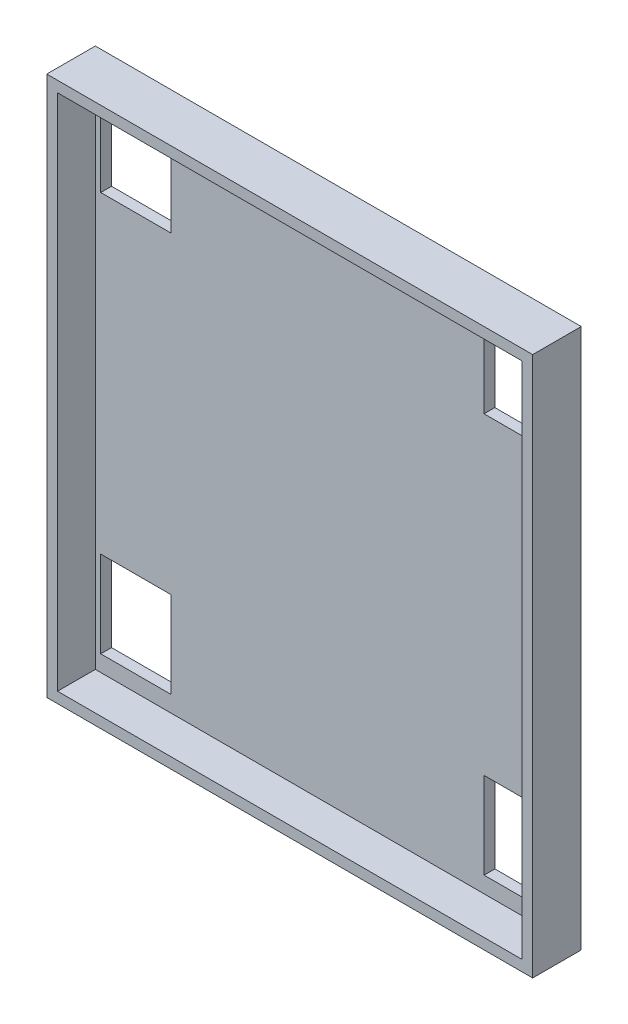
ISO-10303-21;
HEADER;
FILE_DESCRIPTION(('STEP AP214'),'2;1');
FILE_NAME('part.step','',(''),(''),'','','');
FILE_SCHEMA(('AUTOMOTIVE_DESIGN { 1 0 10303 214 1 1 1 1 }'));
ENDSEC;
DATA;
#1=APPLICATION_CONTEXT('core data for automotive mechanical design processes');
#2=APPLICATION_PROTOCOL_DEFINITION('international standard','automotive_design',2000,#1);
#3=PRODUCT_CONTEXT('',#1,'mechanical');
#4=PRODUCT('Part','Part','',(#3));
#5=PRODUCT_RELATED_PRODUCT_CATEGORY('part','',(#4));
#6=PRODUCT_DEFINITION_FORMATION('','',#4);
#7=PRODUCT_DEFINITION_CONTEXT('part definition',#1,'design');
#8=PRODUCT_DEFINITION('design','',#6,#7);
#9=PRODUCT_DEFINITION_SHAPE('','',#8);
#10=(LENGTH_UNIT() NAMED_UNIT(*) SI_UNIT(.MILLI.,.METRE.));
#11=(NAMED_UNIT(*) PLANE_ANGLE_UNIT() SI_UNIT($,.RADIAN.));
#12=(NAMED_UNIT(*) SI_UNIT($,.STERADIAN.) SOLID_ANGLE_UNIT());
#13=UNCERTAINTY_MEASURE_WITH_UNIT(LENGTH_MEASURE(1.E-05),#10,'distance_accuracy_value','');
#14=(GEOMETRIC_REPRESENTATION_CONTEXT(3) GLOBAL_UNCERTAINTY_ASSIGNED_CONTEXT((#13)) GLOBAL_UNIT_ASSIGNED_CONTEXT((#10,
#11,#12)) REPRESENTATION_CONTEXT('',''));
#15=CARTESIAN_POINT('',(0.,0.,0.));
#16=DIRECTION('',(0.,0.,1.));
#17=DIRECTION('',(1.,0.,0.));
#18=AXIS2_PLACEMENT_3D('',#15,#16,#17);
#19=CARTESIAN_POINT('',(0.,0.,2.));
#20=DIRECTION('',(0.,0.,1.));
#21=DIRECTION('',(1.,0.,0.));
#22=AXIS2_PLACEMENT_3D('',#19,#20,#21);
#23=PLANE('',#22);
#24=DIRECTION('',(0.,-1.,0.));
#25=VECTOR('',#24,1.);
#26=CARTESIAN_POINT('',(-43.,-48.,2.));
#27=LINE('',#26,#25);
#28=CARTESIAN_POINT('',(-43.,48.,2.));
#29=VERTEX_POINT('',#28);
#30=CARTESIAN_POINT('',(-43.,-48.,2.));
#31=VERTEX_POINT('',#30);
#32=EDGE_CURVE('E47',#29,#31,#27,.T.);
#33=ORIENTED_EDGE('',*,*,#32,.T.);
#34=DIRECTION('',(1.,0.,0.));
#35=VECTOR('',#34,1.);
#36=CARTESIAN_POINT('',(-43.,-48.,2.));
#37=LINE('',#36,#35);
#38=CARTESIAN_POINT('',(43.,-48.,2.));
#39=VERTEX_POINT('',#38);
#40=EDGE_CURVE('E51',#31,#39,#37,.T.);
#41=ORIENTED_EDGE('',*,*,#40,.T.);
#42=DIRECTION('',(0.,1.,0.));
#43=VECTOR('',#42,1.);
#44=CARTESIAN_POINT('',(43.,-48.,2.));
#45=LINE('',#44,#43);
#46=CARTESIAN_POINT('',(43.,48.,2.));
#47=VERTEX_POINT('',#46);
#48=EDGE_CURVE('E221',#39,#47,#45,.T.);
#49=ORIENTED_EDGE('',*,*,#48,.T.);
#50=DIRECTION('',(-1.,0.,0.));
#51=VECTOR('',#50,1.);
#52=CARTESIAN_POINT('',(-43.,48.,2.));
#53=LINE('',#52,#51);
#54=EDGE_CURVE('E202',#47,#29,#53,.T.);
#55=ORIENTED_EDGE('',*,*,#54,.T.);
#56=EDGE_LOOP('',(#33,#41,#49,#55));
#57=FACE_BOUND('',#56,.T.);
#58=DIRECTION('',(-1.,0.,0.));
#59=VECTOR('',#58,1.);
#60=CARTESIAN_POINT('',(29.,45.,2.));
#61=LINE('',#60,#59);
#62=CARTESIAN_POINT('',(42.,45.,2.));
#63=VERTEX_POINT('',#62);
#64=CARTESIAN_POINT('',(29.,45.,2.));
#65=VERTEX_POINT('',#64);
#66=EDGE_CURVE('E336',#63,#65,#61,.T.);
#67=ORIENTED_EDGE('',*,*,#66,.F.);
#68=DIRECTION('',(0.,1.,0.));
#69=VECTOR('',#68,1.);
#70=CARTESIAN_POINT('',(42.,45.,2.));
#71=LINE('',#70,#69);
#72=CARTESIAN_POINT('',(42.,29.,2.));
#73=VERTEX_POINT('',#72);
#74=EDGE_CURVE('E334',#73,#63,#71,.T.);
#75=ORIENTED_EDGE('',*,*,#74,.F.);
#76=DIRECTION('',(1.,0.,0.));
#77=VECTOR('',#76,1.);
#78=CARTESIAN_POINT('',(29.,29.,2.));
#79=LINE('',#78,#77);
#80=CARTESIAN_POINT('',(29.,29.,2.));
#81=VERTEX_POINT('',#80);
#82=EDGE_CURVE('E342',#81,#73,#79,.T.);
#83=ORIENTED_EDGE('',*,*,#82,.F.);
#84=DIRECTION('',(0.,-1.,0.));
#85=VECTOR('',#84,1.);
#86=CARTESIAN_POINT('',(29.,45.,2.));
#87=LINE('',#86,#85);
#88=EDGE_CURVE('E339',#65,#81,#87,.T.);
#89=ORIENTED_EDGE('',*,*,#88,.F.);
#90=EDGE_LOOP('',(#67,#75,#83,#89));
#91=FACE_BOUND('',#90,.T.);
#92=DIRECTION('',(1.,0.,0.));
#93=VECTOR('',#92,1.);
#94=CARTESIAN_POINT('',(29.,-45.,2.));
#95=LINE('',#94,#93);
#96=CARTESIAN_POINT('',(29.,-45.,2.));
#97=VERTEX_POINT('',#96);
#98=CARTESIAN_POINT('',(42.,-45.,2.));
#99=VERTEX_POINT('',#98);
#100=EDGE_CURVE('E305',#97,#99,#95,.T.);
#101=ORIENTED_EDGE('',*,*,#100,.F.);
#102=DIRECTION('',(0.,-1.,0.));
#103=VECTOR('',#102,1.);
#104=CARTESIAN_POINT('',(29.,-45.,2.));
#105=LINE('',#104,#103);
#106=CARTESIAN_POINT('',(29.,-29.,2.));
#107=VERTEX_POINT('',#106);
#108=EDGE_CURVE('E303',#107,#97,#105,.T.);
#109=ORIENTED_EDGE('',*,*,#108,.F.);
#110=DIRECTION('',(-1.,0.,0.));
#111=VECTOR('',#110,1.);
#112=CARTESIAN_POINT('',(29.,-29.,2.));
#113=LINE('',#112,#111);
#114=CARTESIAN_POINT('',(42.,-29.,2.));
#115=VERTEX_POINT('',#114);
#116=EDGE_CURVE('E311',#115,#107,#113,.T.);
#117=ORIENTED_EDGE('',*,*,#116,.F.);
#118=DIRECTION('',(0.,1.,0.));
#119=VECTOR('',#118,1.);
#120=CARTESIAN_POINT('',(42.,-45.,2.));
#121=LINE('',#120,#119);
#122=EDGE_CURVE('E308',#99,#115,#121,.T.);
#123=ORIENTED_EDGE('',*,*,#122,.F.);
#124=EDGE_LOOP('',(#101,#109,#117,#123));
#125=FACE_BOUND('',#124,.T.);
#126=DIRECTION('',(-1.,0.,0.));
#127=VECTOR('',#126,1.);
#128=CARTESIAN_POINT('',(-29.,-29.,2.));
#129=LINE('',#128,#127);
#130=CARTESIAN_POINT('',(-29.,-29.,2.));
#131=VERTEX_POINT('',#130);
#132=CARTESIAN_POINT('',(-42.,-29.,2.));
#133=VERTEX_POINT('',#132);
#134=EDGE_CURVE('E274',#131,#133,#129,.T.);
#135=ORIENTED_EDGE('',*,*,#134,.F.);
#136=DIRECTION('',(0.,1.,0.));
#137=VECTOR('',#136,1.);
#138=CARTESIAN_POINT('',(-29.,-45.,2.));
#139=LINE('',#138,#137);
#140=CARTESIAN_POINT('',(-29.,-45.,2.));
#141=VERTEX_POINT('',#140);
#142=EDGE_CURVE('E272',#141,#131,#139,.T.);
#143=ORIENTED_EDGE('',*,*,#142,.F.);
#144=DIRECTION('',(1.,0.,0.));
#145=VECTOR('',#144,1.);
#146=CARTESIAN_POINT('',(-29.,-45.,2.));
#147=LINE('',#146,#145);
#148=CARTESIAN_POINT('',(-42.,-45.,2.));
#149=VERTEX_POINT('',#148);
#150=EDGE_CURVE('E280',#149,#141,#147,.T.);
#151=ORIENTED_EDGE('',*,*,#150,.F.);
#152=DIRECTION('',(0.,-1.,0.));
#153=VECTOR('',#152,1.);
#154=CARTESIAN_POINT('',(-42.,-45.,2.));
#155=LINE('',#154,#153);
#156=EDGE_CURVE('E277',#133,#149,#155,.T.);
#157=ORIENTED_EDGE('',*,*,#156,.F.);
#158=EDGE_LOOP('',(#135,#143,#151,#157));
#159=FACE_BOUND('',#158,.T.);
#160=DIRECTION('',(-1.,0.,0.));
#161=VECTOR('',#160,1.);
#162=CARTESIAN_POINT('',(-29.,45.,2.));
#163=LINE('',#162,#161);
#164=CARTESIAN_POINT('',(-29.,45.,2.));
#165=VERTEX_POINT('',#164);
#166=CARTESIAN_POINT('',(-42.,45.,2.));
#167=VERTEX_POINT('',#166);
#168=EDGE_CURVE('E243',#165,#167,#163,.T.);
#169=ORIENTED_EDGE('',*,*,#168,.F.);
#170=DIRECTION('',(0.,1.,0.));
#171=VECTOR('',#170,1.);
#172=CARTESIAN_POINT('',(-29.,45.,2.));
#173=LINE('',#172,#171);
#174=CARTESIAN_POINT('',(-29.,29.,2.));
#175=VERTEX_POINT('',#174);
#176=EDGE_CURVE('E241',#175,#165,#173,.T.);
#177=ORIENTED_EDGE('',*,*,#176,.F.);
#178=DIRECTION('',(1.,0.,0.));
#179=VECTOR('',#178,1.);
#180=CARTESIAN_POINT('',(-29.,29.,2.));
#181=LINE('',#180,#179);
#182=CARTESIAN_POINT('',(-42.,29.,2.));
#183=VERTEX_POINT('',#182);
#184=EDGE_CURVE('E249',#183,#175,#181,.T.);
#185=ORIENTED_EDGE('',*,*,#184,.F.);
#186=DIRECTION('',(0.,-1.,0.));
#187=VECTOR('',#186,1.);
#188=CARTESIAN_POINT('',(-42.,45.,2.));
#189=LINE('',#188,#187);
#190=EDGE_CURVE('E246',#167,#183,#189,.T.);
#191=ORIENTED_EDGE('',*,*,#190,.F.);
#192=EDGE_LOOP('',(#169,#177,#185,#191));
#193=FACE_BOUND('',#192,.T.);
#194=ADVANCED_FACE('F32',(#57,#91,#125,#159,#193),#23,.T.);
#195=CARTESIAN_POINT('',(0.,0.,0.));
#196=DIRECTION('',(0.,0.,1.));
#197=DIRECTION('',(1.,0.,0.));
#198=AXIS2_PLACEMENT_3D('',#195,#196,#197);
#199=PLANE('',#198);
#200=DIRECTION('',(0.,1.,0.));
#201=VECTOR('',#200,1.);
#202=CARTESIAN_POINT('',(-29.,-45.,0.));
#203=LINE('',#202,#201);
#204=CARTESIAN_POINT('',(-29.,-45.,0.));
#205=VERTEX_POINT('',#204);
#206=CARTESIAN_POINT('',(-29.,-29.,0.));
#207=VERTEX_POINT('',#206);
#208=EDGE_CURVE('E271',#205,#207,#203,.T.);
#209=ORIENTED_EDGE('',*,*,#208,.T.);
#210=DIRECTION('',(-1.,0.,0.));
#211=VECTOR('',#210,1.);
#212=CARTESIAN_POINT('',(-29.,-29.,0.));
#213=LINE('',#212,#211);
#214=CARTESIAN_POINT('',(-42.,-29.,0.));
#215=VERTEX_POINT('',#214);
#216=EDGE_CURVE('E285',#207,#215,#213,.T.);
#217=ORIENTED_EDGE('',*,*,#216,.T.);
#218=DIRECTION('',(0.,-1.,0.));
#219=VECTOR('',#218,1.);
#220=CARTESIAN_POINT('',(-42.,-45.,0.));
#221=LINE('',#220,#219);
#222=CARTESIAN_POINT('',(-42.,-45.,0.));
#223=VERTEX_POINT('',#222);
#224=EDGE_CURVE('E288',#215,#223,#221,.T.);
#225=ORIENTED_EDGE('',*,*,#224,.T.);
#226=DIRECTION('',(1.,0.,0.));
#227=VECTOR('',#226,1.);
#228=CARTESIAN_POINT('',(-29.,-45.,0.));
#229=LINE('',#228,#227);
#230=EDGE_CURVE('E275',#223,#205,#229,.T.);
#231=ORIENTED_EDGE('',*,*,#230,.T.);
#232=EDGE_LOOP('',(#209,#217,#225,#231));
#233=FACE_BOUND('',#232,.T.);
#234=DIRECTION('',(0.,1.,0.));
#235=VECTOR('',#234,1.);
#236=CARTESIAN_POINT('',(42.,45.,0.));
#237=LINE('',#236,#235);
#238=CARTESIAN_POINT('',(42.,29.,0.));
#239=VERTEX_POINT('',#238);
#240=CARTESIAN_POINT('',(42.,45.,0.));
#241=VERTEX_POINT('',#240);
#242=EDGE_CURVE('E333',#239,#241,#237,.T.);
#243=ORIENTED_EDGE('',*,*,#242,.T.);
#244=DIRECTION('',(-1.,0.,0.));
#245=VECTOR('',#244,1.);
#246=CARTESIAN_POINT('',(29.,45.,0.));
#247=LINE('',#246,#245);
#248=CARTESIAN_POINT('',(29.,45.,0.));
#249=VERTEX_POINT('',#248);
#250=EDGE_CURVE('E347',#241,#249,#247,.T.);
#251=ORIENTED_EDGE('',*,*,#250,.T.);
#252=DIRECTION('',(0.,-1.,0.));
#253=VECTOR('',#252,1.);
#254=CARTESIAN_POINT('',(29.,45.,0.));
#255=LINE('',#254,#253);
#256=CARTESIAN_POINT('',(29.,29.,0.));
#257=VERTEX_POINT('',#256);
#258=EDGE_CURVE('E350',#249,#257,#255,.T.);
#259=ORIENTED_EDGE('',*,*,#258,.T.);
#260=DIRECTION('',(1.,0.,0.));
#261=VECTOR('',#260,1.);
#262=CARTESIAN_POINT('',(29.,29.,0.));
#263=LINE('',#262,#261);
#264=EDGE_CURVE('E337',#257,#239,#263,.T.);
#265=ORIENTED_EDGE('',*,*,#264,.T.);
#266=EDGE_LOOP('',(#243,#251,#259,#265));
#267=FACE_BOUND('',#266,.T.);
#268=DIRECTION('',(0.,1.,0.));
#269=VECTOR('',#268,1.);
#270=CARTESIAN_POINT('',(45.,50.,0.));
#271=LINE('',#270,#269);
#272=CARTESIAN_POINT('',(45.,-50.,0.));
#273=VERTEX_POINT('',#272);
#274=CARTESIAN_POINT('',(45.,50.,0.));
#275=VERTEX_POINT('',#274);
#276=EDGE_CURVE('E364',#273,#275,#271,.T.);
#277=ORIENTED_EDGE('',*,*,#276,.F.);
#278=DIRECTION('',(1.,0.,0.));
#279=VECTOR('',#278,1.);
#280=CARTESIAN_POINT('',(-45.,-50.,0.));
#281=LINE('',#280,#279);
#282=CARTESIAN_POINT('',(-45.,-50.,0.));
#283=VERTEX_POINT('',#282);
#284=EDGE_CURVE('E371',#283,#273,#281,.T.);
#285=ORIENTED_EDGE('',*,*,#284,.F.);
#286=DIRECTION('',(0.,-1.,0.));
#287=VECTOR('',#286,1.);
#288=CARTESIAN_POINT('',(-45.,50.,0.));
#289=LINE('',#288,#287);
#290=CARTESIAN_POINT('',(-45.,50.,0.));
#291=VERTEX_POINT('',#290);
#292=EDGE_CURVE('E369',#291,#283,#289,.T.);
#293=ORIENTED_EDGE('',*,*,#292,.F.);
#294=DIRECTION('',(-1.,0.,0.));
#295=VECTOR('',#294,1.);
#296=CARTESIAN_POINT('',(-45.,50.,0.));
#297=LINE('',#296,#295);
#298=EDGE_CURVE('E367',#275,#291,#297,.T.);
#299=ORIENTED_EDGE('',*,*,#298,.F.);
#300=EDGE_LOOP('',(#277,#285,#293,#299));
#301=FACE_BOUND('',#300,.T.);
#302=DIRECTION('',(0.,-1.,0.));
#303=VECTOR('',#302,1.);
#304=CARTESIAN_POINT('',(29.,-45.,0.));
#305=LINE('',#304,#303);
#306=CARTESIAN_POINT('',(29.,-29.,0.));
#307=VERTEX_POINT('',#306);
#308=CARTESIAN_POINT('',(29.,-45.,0.));
#309=VERTEX_POINT('',#308);
#310=EDGE_CURVE('E302',#307,#309,#305,.T.);
#311=ORIENTED_EDGE('',*,*,#310,.T.);
#312=DIRECTION('',(1.,0.,0.));
#313=VECTOR('',#312,1.);
#314=CARTESIAN_POINT('',(29.,-45.,0.));
#315=LINE('',#314,#313);
#316=CARTESIAN_POINT('',(42.,-45.,0.));
#317=VERTEX_POINT('',#316);
#318=EDGE_CURVE('E316',#309,#317,#315,.T.);
#319=ORIENTED_EDGE('',*,*,#318,.T.);
#320=DIRECTION('',(0.,1.,0.));
#321=VECTOR('',#320,1.);
#322=CARTESIAN_POINT('',(42.,-45.,0.));
#323=LINE('',#322,#321);
#324=CARTESIAN_POINT('',(42.,-29.,0.));
#325=VERTEX_POINT('',#324);
#326=EDGE_CURVE('E319',#317,#325,#323,.T.);
#327=ORIENTED_EDGE('',*,*,#326,.T.);
#328=DIRECTION('',(-1.,0.,0.));
#329=VECTOR('',#328,1.);
#330=CARTESIAN_POINT('',(29.,-29.,0.));
#331=LINE('',#330,#329);
#332=EDGE_CURVE('E306',#325,#307,#331,.T.);
#333=ORIENTED_EDGE('',*,*,#332,.T.);
#334=EDGE_LOOP('',(#311,#319,#327,#333));
#335=FACE_BOUND('',#334,.T.);
#336=DIRECTION('',(0.,1.,0.));
#337=VECTOR('',#336,1.);
#338=CARTESIAN_POINT('',(-29.,45.,0.));
#339=LINE('',#338,#337);
#340=CARTESIAN_POINT('',(-29.,29.,0.));
#341=VERTEX_POINT('',#340);
#342=CARTESIAN_POINT('',(-29.,45.,0.));
#343=VERTEX_POINT('',#342);
#344=EDGE_CURVE('E240',#341,#343,#339,.T.);
#345=ORIENTED_EDGE('',*,*,#344,.T.);
#346=DIRECTION('',(-1.,0.,0.));
#347=VECTOR('',#346,1.);
#348=CARTESIAN_POINT('',(-29.,45.,0.));
#349=LINE('',#348,#347);
#350=CARTESIAN_POINT('',(-42.,45.,0.));
#351=VERTEX_POINT('',#350);
#352=EDGE_CURVE('E254',#343,#351,#349,.T.);
#353=ORIENTED_EDGE('',*,*,#352,.T.);
#354=DIRECTION('',(0.,-1.,0.));
#355=VECTOR('',#354,1.);
#356=CARTESIAN_POINT('',(-42.,45.,0.));
#357=LINE('',#356,#355);
#358=CARTESIAN_POINT('',(-42.,29.,0.));
#359=VERTEX_POINT('',#358);
#360=EDGE_CURVE('E257',#351,#359,#357,.T.);
#361=ORIENTED_EDGE('',*,*,#360,.T.);
#362=DIRECTION('',(1.,0.,0.));
#363=VECTOR('',#362,1.);
#364=CARTESIAN_POINT('',(-29.,29.,0.));
#365=LINE('',#364,#363);
#366=EDGE_CURVE('E244',#359,#341,#365,.T.);
#367=ORIENTED_EDGE('',*,*,#366,.T.);
#368=EDGE_LOOP('',(#345,#353,#361,#367));
#369=FACE_BOUND('',#368,.T.);
#370=ADVANCED_FACE('F388',(#233,#267,#301,#335,#369),#199,.F.);
#371=CARTESIAN_POINT('',(45.,50.,2.));
#372=DIRECTION('',(-1.,0.,0.));
#373=DIRECTION('',(0.,0.,1.));
#374=AXIS2_PLACEMENT_3D('',#371,#372,#373);
#375=PLANE('',#374);
#376=ORIENTED_EDGE('',*,*,#276,.T.);
#377=DIRECTION('',(0.,0.,-1.));
#378=VECTOR('',#377,1.);
#379=CARTESIAN_POINT('',(45.,50.,2.));
#380=LINE('',#379,#378);
#381=CARTESIAN_POINT('',(45.,50.,9.));
#382=VERTEX_POINT('',#381);
#383=EDGE_CURVE('E11',#382,#275,#380,.T.);
#384=ORIENTED_EDGE('',*,*,#383,.F.);
#385=DIRECTION('',(0.,1.,0.));
#386=VECTOR('',#385,1.);
#387=CARTESIAN_POINT('',(45.,-50.,9.));
#388=LINE('',#387,#386);
#389=CARTESIAN_POINT('',(45.,-50.,9.));
#390=VERTEX_POINT('',#389);
#391=EDGE_CURVE('E207',#390,#382,#388,.T.);
#392=ORIENTED_EDGE('',*,*,#391,.F.);
#393=DIRECTION('',(0.,0.,-1.));
#394=VECTOR('',#393,1.);
#395=CARTESIAN_POINT('',(45.,-50.,2.));
#396=LINE('',#395,#394);
#397=EDGE_CURVE('E373',#390,#273,#396,.T.);
#398=ORIENTED_EDGE('',*,*,#397,.T.);
#399=EDGE_LOOP('',(#376,#384,#392,#398));
#400=FACE_BOUND('',#399,.T.);
#401=ADVANCED_FACE('F34',(#400),#375,.F.);
#402=CARTESIAN_POINT('',(-45.,50.,2.));
#403=DIRECTION('',(0.,-1.,0.));
#404=DIRECTION('',(0.,0.,-1.));
#405=AXIS2_PLACEMENT_3D('',#402,#403,#404);
#406=PLANE('',#405);
#407=ORIENTED_EDGE('',*,*,#298,.T.);
#408=DIRECTION('',(0.,0.,-1.));
#409=VECTOR('',#408,1.);
#410=CARTESIAN_POINT('',(-45.,50.,2.));
#411=LINE('',#410,#409);
#412=CARTESIAN_POINT('',(-45.,50.,9.));
#413=VERTEX_POINT('',#412);
#414=EDGE_CURVE('E40',#413,#291,#411,.T.);
#415=ORIENTED_EDGE('',*,*,#414,.F.);
#416=DIRECTION('',(-1.,0.,0.));
#417=VECTOR('',#416,1.);
#418=CARTESIAN_POINT('',(-45.,50.,9.));
#419=LINE('',#418,#417);
#420=EDGE_CURVE('E231',#382,#413,#419,.T.);
#421=ORIENTED_EDGE('',*,*,#420,.F.);
#422=ORIENTED_EDGE('',*,*,#383,.T.);
#423=EDGE_LOOP('',(#407,#415,#421,#422));
#424=FACE_BOUND('',#423,.T.);
#425=ADVANCED_FACE('F396',(#424),#406,.F.);
#426=CARTESIAN_POINT('',(-45.,50.,2.));
#427=DIRECTION('',(1.,0.,0.));
#428=DIRECTION('',(0.,0.,-1.));
#429=AXIS2_PLACEMENT_3D('',#426,#427,#428);
#430=PLANE('',#429);
#431=ORIENTED_EDGE('',*,*,#292,.T.);
#432=DIRECTION('',(0.,0.,-1.));
#433=VECTOR('',#432,1.);
#434=CARTESIAN_POINT('',(-45.,-50.,2.));
#435=LINE('',#434,#433);
#436=CARTESIAN_POINT('',(-45.,-50.,9.));
#437=VERTEX_POINT('',#436);
#438=EDGE_CURVE('E376',#437,#283,#435,.T.);
#439=ORIENTED_EDGE('',*,*,#438,.F.);
#440=DIRECTION('',(0.,-1.,0.));
#441=VECTOR('',#440,1.);
#442=CARTESIAN_POINT('',(-45.,-50.,9.));
#443=LINE('',#442,#441);
#444=EDGE_CURVE('E234',#413,#437,#443,.T.);
#445=ORIENTED_EDGE('',*,*,#444,.F.);
#446=ORIENTED_EDGE('',*,*,#414,.T.);
#447=EDGE_LOOP('',(#431,#439,#445,#446));
#448=FACE_BOUND('',#447,.T.);
#449=ADVANCED_FACE('F382',(#448),#430,.F.);
#450=CARTESIAN_POINT('',(-45.,-50.,2.));
#451=DIRECTION('',(0.,1.,0.));
#452=DIRECTION('',(0.,0.,1.));
#453=AXIS2_PLACEMENT_3D('',#450,#451,#452);
#454=PLANE('',#453);
#455=ORIENTED_EDGE('',*,*,#284,.T.);
#456=ORIENTED_EDGE('',*,*,#397,.F.);
#457=DIRECTION('',(1.,0.,0.));
#458=VECTOR('',#457,1.);
#459=CARTESIAN_POINT('',(-45.,-50.,9.));
#460=LINE('',#459,#458);
#461=EDGE_CURVE('E237',#437,#390,#460,.T.);
#462=ORIENTED_EDGE('',*,*,#461,.F.);
#463=ORIENTED_EDGE('',*,*,#438,.T.);
#464=EDGE_LOOP('',(#455,#456,#462,#463));
#465=FACE_BOUND('',#464,.T.);
#466=ADVANCED_FACE('F391',(#465),#454,.F.);
#467=CARTESIAN_POINT('',(42.,45.,2.));
#468=DIRECTION('',(-1.,0.,0.));
#469=DIRECTION('',(0.,0.,1.));
#470=AXIS2_PLACEMENT_3D('',#467,#468,#469);
#471=PLANE('',#470);
#472=ORIENTED_EDGE('',*,*,#242,.F.);
#473=DIRECTION('',(0.,0.,-1.));
#474=VECTOR('',#473,1.);
#475=CARTESIAN_POINT('',(42.,29.,2.));
#476=LINE('',#475,#474);
#477=EDGE_CURVE('E344',#73,#239,#476,.T.);
#478=ORIENTED_EDGE('',*,*,#477,.F.);
#479=ORIENTED_EDGE('',*,*,#74,.T.);
#480=DIRECTION('',(0.,0.,-1.));
#481=VECTOR('',#480,1.);
#482=CARTESIAN_POINT('',(42.,45.,2.));
#483=LINE('',#482,#481);
#484=EDGE_CURVE('E361',#63,#241,#483,.T.);
#485=ORIENTED_EDGE('',*,*,#484,.T.);
#486=EDGE_LOOP('',(#472,#478,#479,#485));
#487=FACE_BOUND('',#486,.T.);
#488=ADVANCED_FACE('F412',(#487),#471,.T.);
#489=CARTESIAN_POINT('',(29.,45.,2.));
#490=DIRECTION('',(0.,-1.,0.));
#491=DIRECTION('',(0.,0.,-1.));
#492=AXIS2_PLACEMENT_3D('',#489,#490,#491);
#493=PLANE('',#492);
#494=ORIENTED_EDGE('',*,*,#250,.F.);
#495=ORIENTED_EDGE('',*,*,#484,.F.);
#496=ORIENTED_EDGE('',*,*,#66,.T.);
#497=DIRECTION('',(0.,0.,-1.));
#498=VECTOR('',#497,1.);
#499=CARTESIAN_POINT('',(29.,45.,2.));
#500=LINE('',#499,#498);
#501=EDGE_CURVE('E359',#65,#249,#500,.T.);
#502=ORIENTED_EDGE('',*,*,#501,.T.);
#503=EDGE_LOOP('',(#494,#495,#496,#502));
#504=FACE_BOUND('',#503,.T.);
#505=ADVANCED_FACE('F419',(#504),#493,.T.);
#506=CARTESIAN_POINT('',(29.,45.,2.));
#507=DIRECTION('',(1.,0.,0.));
#508=DIRECTION('',(0.,0.,-1.));
#509=AXIS2_PLACEMENT_3D('',#506,#507,#508);
#510=PLANE('',#509);
#511=ORIENTED_EDGE('',*,*,#258,.F.);
#512=ORIENTED_EDGE('',*,*,#501,.F.);
#513=ORIENTED_EDGE('',*,*,#88,.T.);
#514=DIRECTION('',(0.,0.,-1.));
#515=VECTOR('',#514,1.);
#516=CARTESIAN_POINT('',(29.,29.,2.));
#517=LINE('',#516,#515);
#518=EDGE_CURVE('E357',#81,#257,#517,.T.);
#519=ORIENTED_EDGE('',*,*,#518,.T.);
#520=EDGE_LOOP('',(#511,#512,#513,#519));
#521=FACE_BOUND('',#520,.T.);
#522=ADVANCED_FACE('F424',(#521),#510,.T.);
#523=CARTESIAN_POINT('',(29.,29.,2.));
#524=DIRECTION('',(0.,1.,0.));
#525=DIRECTION('',(0.,0.,1.));
#526=AXIS2_PLACEMENT_3D('',#523,#524,#525);
#527=PLANE('',#526);
#528=ORIENTED_EDGE('',*,*,#264,.F.);
#529=ORIENTED_EDGE('',*,*,#518,.F.);
#530=ORIENTED_EDGE('',*,*,#82,.T.);
#531=ORIENTED_EDGE('',*,*,#477,.T.);
#532=EDGE_LOOP('',(#528,#529,#530,#531));
#533=FACE_BOUND('',#532,.T.);
#534=ADVANCED_FACE('F432',(#533),#527,.T.);
#535=CARTESIAN_POINT('',(29.,-45.,2.));
#536=DIRECTION('',(1.,0.,0.));
#537=DIRECTION('',(0.,0.,-1.));
#538=AXIS2_PLACEMENT_3D('',#535,#536,#537);
#539=PLANE('',#538);
#540=ORIENTED_EDGE('',*,*,#310,.F.);
#541=DIRECTION('',(0.,0.,-1.));
#542=VECTOR('',#541,1.);
#543=CARTESIAN_POINT('',(29.,-29.,2.));
#544=LINE('',#543,#542);
#545=EDGE_CURVE('E313',#107,#307,#544,.T.);
#546=ORIENTED_EDGE('',*,*,#545,.F.);
#547=ORIENTED_EDGE('',*,*,#108,.T.);
#548=DIRECTION('',(0.,0.,-1.));
#549=VECTOR('',#548,1.);
#550=CARTESIAN_POINT('',(29.,-45.,2.));
#551=LINE('',#550,#549);
#552=EDGE_CURVE('E330',#97,#309,#551,.T.);
#553=ORIENTED_EDGE('',*,*,#552,.T.);
#554=EDGE_LOOP('',(#540,#546,#547,#553));
#555=FACE_BOUND('',#554,.T.);
#556=ADVANCED_FACE('F507',(#555),#539,.T.);
#557=CARTESIAN_POINT('',(29.,-45.,2.));
#558=DIRECTION('',(0.,1.,0.));
#559=DIRECTION('',(0.,0.,1.));
#560=AXIS2_PLACEMENT_3D('',#557,#558,#559);
#561=PLANE('',#560);
#562=ORIENTED_EDGE('',*,*,#318,.F.);
#563=ORIENTED_EDGE('',*,*,#552,.F.);
#564=ORIENTED_EDGE('',*,*,#100,.T.);
#565=DIRECTION('',(0.,0.,-1.));
#566=VECTOR('',#565,1.);
#567=CARTESIAN_POINT('',(42.,-45.,2.));
#568=LINE('',#567,#566);
#569=EDGE_CURVE('E328',#99,#317,#568,.T.);
#570=ORIENTED_EDGE('',*,*,#569,.T.);
#571=EDGE_LOOP('',(#562,#563,#564,#570));
#572=FACE_BOUND('',#571,.T.);
#573=ADVANCED_FACE('F503',(#572),#561,.T.);
#574=CARTESIAN_POINT('',(42.,-45.,2.));
#575=DIRECTION('',(-1.,0.,0.));
#576=DIRECTION('',(0.,0.,1.));
#577=AXIS2_PLACEMENT_3D('',#574,#575,#576);
#578=PLANE('',#577);
#579=ORIENTED_EDGE('',*,*,#326,.F.);
#580=ORIENTED_EDGE('',*,*,#569,.F.);
#581=ORIENTED_EDGE('',*,*,#122,.T.);
#582=DIRECTION('',(0.,0.,-1.));
#583=VECTOR('',#582,1.);
#584=CARTESIAN_POINT('',(42.,-29.,2.));
#585=LINE('',#584,#583);
#586=EDGE_CURVE('E326',#115,#325,#585,.T.);
#587=ORIENTED_EDGE('',*,*,#586,.T.);
#588=EDGE_LOOP('',(#579,#580,#581,#587));
#589=FACE_BOUND('',#588,.T.);
#590=ADVANCED_FACE('F499',(#589),#578,.T.);
#591=CARTESIAN_POINT('',(29.,-29.,2.));
#592=DIRECTION('',(0.,-1.,0.));
#593=DIRECTION('',(0.,0.,-1.));
#594=AXIS2_PLACEMENT_3D('',#591,#592,#593);
#595=PLANE('',#594);
#596=ORIENTED_EDGE('',*,*,#332,.F.);
#597=ORIENTED_EDGE('',*,*,#586,.F.);
#598=ORIENTED_EDGE('',*,*,#116,.T.);
#599=ORIENTED_EDGE('',*,*,#545,.T.);
#600=EDGE_LOOP('',(#596,#597,#598,#599));
#601=FACE_BOUND('',#600,.T.);
#602=ADVANCED_FACE('F495',(#601),#595,.T.);
#603=CARTESIAN_POINT('',(-29.,-45.,2.));
#604=DIRECTION('',(-1.,0.,0.));
#605=DIRECTION('',(0.,0.,1.));
#606=AXIS2_PLACEMENT_3D('',#603,#604,#605);
#607=PLANE('',#606);
#608=ORIENTED_EDGE('',*,*,#208,.F.);
#609=DIRECTION('',(0.,0.,-1.));
#610=VECTOR('',#609,1.);
#611=CARTESIAN_POINT('',(-29.,-45.,2.));
#612=LINE('',#611,#610);
#613=EDGE_CURVE('E282',#141,#205,#612,.T.);
#614=ORIENTED_EDGE('',*,*,#613,.F.);
#615=ORIENTED_EDGE('',*,*,#142,.T.);
#616=DIRECTION('',(0.,0.,-1.));
#617=VECTOR('',#616,1.);
#618=CARTESIAN_POINT('',(-29.,-29.,2.));
#619=LINE('',#618,#617);
#620=EDGE_CURVE('E299',#131,#207,#619,.T.);
#621=ORIENTED_EDGE('',*,*,#620,.T.);
#622=EDGE_LOOP('',(#608,#614,#615,#621));
#623=FACE_BOUND('',#622,.T.);
#624=ADVANCED_FACE('F491',(#623),#607,.T.);
#625=CARTESIAN_POINT('',(-29.,-29.,2.));
#626=DIRECTION('',(0.,-1.,0.));
#627=DIRECTION('',(1.,0.,0.));
#628=AXIS2_PLACEMENT_3D('',#625,#626,#627);
#629=PLANE('',#628);
#630=ORIENTED_EDGE('',*,*,#216,.F.);
#631=ORIENTED_EDGE('',*,*,#620,.F.);
#632=ORIENTED_EDGE('',*,*,#134,.T.);
#633=DIRECTION('',(0.,0.,-1.));
#634=VECTOR('',#633,1.);
#635=CARTESIAN_POINT('',(-42.,-29.,2.));
#636=LINE('',#635,#634);
#637=EDGE_CURVE('E297',#133,#215,#636,.T.);
#638=ORIENTED_EDGE('',*,*,#637,.T.);
#639=EDGE_LOOP('',(#630,#631,#632,#638));
#640=FACE_BOUND('',#639,.T.);
#641=ADVANCED_FACE('F487',(#640),#629,.T.);
#642=CARTESIAN_POINT('',(-42.,-45.,2.));
#643=DIRECTION('',(1.,0.,0.));
#644=DIRECTION('',(0.,1.,0.));
#645=AXIS2_PLACEMENT_3D('',#642,#643,#644);
#646=PLANE('',#645);
#647=ORIENTED_EDGE('',*,*,#224,.F.);
#648=ORIENTED_EDGE('',*,*,#637,.F.);
#649=ORIENTED_EDGE('',*,*,#156,.T.);
#650=DIRECTION('',(0.,0.,-1.));
#651=VECTOR('',#650,1.);
#652=CARTESIAN_POINT('',(-42.,-45.,2.));
#653=LINE('',#652,#651);
#654=EDGE_CURVE('E295',#149,#223,#653,.T.);
#655=ORIENTED_EDGE('',*,*,#654,.T.);
#656=EDGE_LOOP('',(#647,#648,#649,#655));
#657=FACE_BOUND('',#656,.T.);
#658=ADVANCED_FACE('F483',(#657),#646,.T.);
#659=CARTESIAN_POINT('',(-29.,-45.,2.));
#660=DIRECTION('',(0.,1.,0.));
#661=DIRECTION('',(0.,0.,1.));
#662=AXIS2_PLACEMENT_3D('',#659,#660,#661);
#663=PLANE('',#662);
#664=ORIENTED_EDGE('',*,*,#230,.F.);
#665=ORIENTED_EDGE('',*,*,#654,.F.);
#666=ORIENTED_EDGE('',*,*,#150,.T.);
#667=ORIENTED_EDGE('',*,*,#613,.T.);
#668=EDGE_LOOP('',(#664,#665,#666,#667));
#669=FACE_BOUND('',#668,.T.);
#670=ADVANCED_FACE('F480',(#669),#663,.T.);
#671=CARTESIAN_POINT('',(-29.,45.,2.));
#672=DIRECTION('',(-1.,0.,0.));
#673=DIRECTION('',(0.,0.,1.));
#674=AXIS2_PLACEMENT_3D('',#671,#672,#673);
#675=PLANE('',#674);
#676=ORIENTED_EDGE('',*,*,#344,.F.);
#677=DIRECTION('',(0.,0.,-1.));
#678=VECTOR('',#677,1.);
#679=CARTESIAN_POINT('',(-29.,29.,2.));
#680=LINE('',#679,#678);
#681=EDGE_CURVE('E251',#175,#341,#680,.T.);
#682=ORIENTED_EDGE('',*,*,#681,.F.);
#683=ORIENTED_EDGE('',*,*,#176,.T.);
#684=DIRECTION('',(0.,0.,-1.));
#685=VECTOR('',#684,1.);
#686=CARTESIAN_POINT('',(-29.,45.,2.));
#687=LINE('',#686,#685);
#688=EDGE_CURVE('E268',#165,#343,#687,.T.);
#689=ORIENTED_EDGE('',*,*,#688,.T.);
#690=EDGE_LOOP('',(#676,#682,#683,#689));
#691=FACE_BOUND('',#690,.T.);
#692=ADVANCED_FACE('F462',(#691),#675,.T.);
#693=CARTESIAN_POINT('',(-29.,45.,2.));
#694=DIRECTION('',(0.,-1.,0.));
#695=DIRECTION('',(0.,0.,-1.));
#696=AXIS2_PLACEMENT_3D('',#693,#694,#695);
#697=PLANE('',#696);
#698=ORIENTED_EDGE('',*,*,#352,.F.);
#699=ORIENTED_EDGE('',*,*,#688,.F.);
#700=ORIENTED_EDGE('',*,*,#168,.T.);
#701=DIRECTION('',(0.,0.,-1.));
#702=VECTOR('',#701,1.);
#703=CARTESIAN_POINT('',(-42.,45.,2.));
#704=LINE('',#703,#702);
#705=EDGE_CURVE('E266',#167,#351,#704,.T.);
#706=ORIENTED_EDGE('',*,*,#705,.T.);
#707=EDGE_LOOP('',(#698,#699,#700,#706));
#708=FACE_BOUND('',#707,.T.);
#709=ADVANCED_FACE('F455',(#708),#697,.T.);
#710=CARTESIAN_POINT('',(-42.,45.,2.));
#711=DIRECTION('',(1.,0.,0.));
#712=DIRECTION('',(0.,1.,0.));
#713=AXIS2_PLACEMENT_3D('',#710,#711,#712);
#714=PLANE('',#713);
#715=ORIENTED_EDGE('',*,*,#360,.F.);
#716=ORIENTED_EDGE('',*,*,#705,.F.);
#717=ORIENTED_EDGE('',*,*,#190,.T.);
#718=DIRECTION('',(0.,0.,-1.));
#719=VECTOR('',#718,1.);
#720=CARTESIAN_POINT('',(-42.,29.,2.));
#721=LINE('',#720,#719);
#722=EDGE_CURVE('E264',#183,#359,#721,.T.);
#723=ORIENTED_EDGE('',*,*,#722,.T.);
#724=EDGE_LOOP('',(#715,#716,#717,#723));
#725=FACE_BOUND('',#724,.T.);
#726=ADVANCED_FACE('F458',(#725),#714,.T.);
#727=CARTESIAN_POINT('',(-29.,29.,2.));
#728=DIRECTION('',(0.,1.,0.));
#729=DIRECTION('',(-1.,0.,0.));
#730=AXIS2_PLACEMENT_3D('',#727,#728,#729);
#731=PLANE('',#730);
#732=ORIENTED_EDGE('',*,*,#366,.F.);
#733=ORIENTED_EDGE('',*,*,#722,.F.);
#734=ORIENTED_EDGE('',*,*,#184,.T.);
#735=ORIENTED_EDGE('',*,*,#681,.T.);
#736=EDGE_LOOP('',(#732,#733,#734,#735));
#737=FACE_BOUND('',#736,.T.);
#738=ADVANCED_FACE('F465',(#737),#731,.T.);
#739=CARTESIAN_POINT('',(0.,0.,9.));
#740=DIRECTION('',(0.,0.,-1.));
#741=DIRECTION('',(-1.,0.,0.));
#742=AXIS2_PLACEMENT_3D('',#739,#740,#741);
#743=PLANE('',#742);
#744=ORIENTED_EDGE('',*,*,#391,.T.);
#745=ORIENTED_EDGE('',*,*,#420,.T.);
#746=ORIENTED_EDGE('',*,*,#444,.T.);
#747=ORIENTED_EDGE('',*,*,#461,.T.);
#748=EDGE_LOOP('',(#744,#745,#746,#747));
#749=FACE_BOUND('',#748,.T.);
#750=DIRECTION('',(0.,-1.,0.));
#751=VECTOR('',#750,1.);
#752=CARTESIAN_POINT('',(-43.,-48.,9.));
#753=LINE('',#752,#751);
#754=CARTESIAN_POINT('',(-43.,48.,9.));
#755=VERTEX_POINT('',#754);
#756=CARTESIAN_POINT('',(-43.,-48.,9.));
#757=VERTEX_POINT('',#756);
#758=EDGE_CURVE('E192',#755,#757,#753,.T.);
#759=ORIENTED_EDGE('',*,*,#758,.F.);
#760=DIRECTION('',(-1.,0.,0.));
#761=VECTOR('',#760,1.);
#762=CARTESIAN_POINT('',(-43.,48.,9.));
#763=LINE('',#762,#761);
#764=CARTESIAN_POINT('',(43.,48.,9.));
#765=VERTEX_POINT('',#764);
#766=EDGE_CURVE('E215',#765,#755,#763,.T.);
#767=ORIENTED_EDGE('',*,*,#766,.F.);
#768=DIRECTION('',(0.,1.,0.));
#769=VECTOR('',#768,1.);
#770=CARTESIAN_POINT('',(43.,-48.,9.));
#771=LINE('',#770,#769);
#772=CARTESIAN_POINT('',(43.,-48.,9.));
#773=VERTEX_POINT('',#772);
#774=EDGE_CURVE('E213',#773,#765,#771,.T.);
#775=ORIENTED_EDGE('',*,*,#774,.F.);
#776=DIRECTION('',(1.,0.,0.));
#777=VECTOR('',#776,1.);
#778=CARTESIAN_POINT('',(-43.,-48.,9.));
#779=LINE('',#778,#777);
#780=EDGE_CURVE('E201',#757,#773,#779,.T.);
#781=ORIENTED_EDGE('',*,*,#780,.F.);
#782=EDGE_LOOP('',(#759,#767,#775,#781));
#783=FACE_BOUND('',#782,.T.);
#784=ADVANCED_FACE('F211',(#749,#783),#743,.F.);
#785=CARTESIAN_POINT('',(-43.,-48.,9.));
#786=DIRECTION('',(1.,0.,0.));
#787=DIRECTION('',(0.,0.,-1.));
#788=AXIS2_PLACEMENT_3D('',#785,#786,#787);
#789=PLANE('',#788);
#790=ORIENTED_EDGE('',*,*,#32,.F.);
#791=DIRECTION('',(0.,0.,-1.));
#792=VECTOR('',#791,1.);
#793=CARTESIAN_POINT('',(-43.,48.,9.));
#794=LINE('',#793,#792);
#795=EDGE_CURVE('E197',#755,#29,#794,.T.);
#796=ORIENTED_EDGE('',*,*,#795,.F.);
#797=ORIENTED_EDGE('',*,*,#758,.T.);
#798=DIRECTION('',(0.,0.,-1.));
#799=VECTOR('',#798,1.);
#800=CARTESIAN_POINT('',(-43.,-48.,9.));
#801=LINE('',#800,#799);
#802=EDGE_CURVE('E195',#757,#31,#801,.T.);
#803=ORIENTED_EDGE('',*,*,#802,.T.);
#804=EDGE_LOOP('',(#790,#796,#797,#803));
#805=FACE_BOUND('',#804,.T.);
#806=ADVANCED_FACE('F194',(#805),#789,.T.);
#807=CARTESIAN_POINT('',(-43.,-48.,9.));
#808=DIRECTION('',(0.,1.,0.));
#809=DIRECTION('',(0.,0.,1.));
#810=AXIS2_PLACEMENT_3D('',#807,#808,#809);
#811=PLANE('',#810);
#812=ORIENTED_EDGE('',*,*,#40,.F.);
#813=ORIENTED_EDGE('',*,*,#802,.F.);
#814=ORIENTED_EDGE('',*,*,#780,.T.);
#815=DIRECTION('',(0.,0.,-1.));
#816=VECTOR('',#815,1.);
#817=CARTESIAN_POINT('',(43.,-48.,9.));
#818=LINE('',#817,#816);
#819=EDGE_CURVE('E208',#773,#39,#818,.T.);
#820=ORIENTED_EDGE('',*,*,#819,.T.);
#821=EDGE_LOOP('',(#812,#813,#814,#820));
#822=FACE_BOUND('',#821,.T.);
#823=ADVANCED_FACE('F205',(#822),#811,.T.);
#824=CARTESIAN_POINT('',(43.,-48.,9.));
#825=DIRECTION('',(-1.,0.,0.));
#826=DIRECTION('',(0.,-1.,0.));
#827=AXIS2_PLACEMENT_3D('',#824,#825,#826);
#828=PLANE('',#827);
#829=ORIENTED_EDGE('',*,*,#48,.F.);
#830=ORIENTED_EDGE('',*,*,#819,.F.);
#831=ORIENTED_EDGE('',*,*,#774,.T.);
#832=DIRECTION('',(0.,0.,-1.));
#833=VECTOR('',#832,1.);
#834=CARTESIAN_POINT('',(43.,48.,9.));
#835=LINE('',#834,#833);
#836=EDGE_CURVE('E225',#765,#47,#835,.T.);
#837=ORIENTED_EDGE('',*,*,#836,.T.);
#838=EDGE_LOOP('',(#829,#830,#831,#837));
#839=FACE_BOUND('',#838,.T.);
#840=ADVANCED_FACE('F622',(#839),#828,.T.);
#841=CARTESIAN_POINT('',(-43.,48.,9.));
#842=DIRECTION('',(0.,-1.,0.));
#843=DIRECTION('',(1.,0.,0.));
#844=AXIS2_PLACEMENT_3D('',#841,#842,#843);
#845=PLANE('',#844);
#846=ORIENTED_EDGE('',*,*,#54,.F.);
#847=ORIENTED_EDGE('',*,*,#836,.F.);
#848=ORIENTED_EDGE('',*,*,#766,.T.);
#849=ORIENTED_EDGE('',*,*,#795,.T.);
#850=EDGE_LOOP('',(#846,#847,#848,#849));
#851=FACE_BOUND('',#850,.T.);
#852=ADVANCED_FACE('F631',(#851),#845,.T.);
#853=CLOSED_SHELL('',(#194,#370,#401,#425,#449,#466,#488,#505,#522,#534,#556,#573,#590,#602,
#624,#641,#658,#670,#692,#709,#726,#738,#784,#806,#823,#840,#852));
#854=MANIFOLD_SOLID_BREP('B2',#853);
#855=ADVANCED_BREP_SHAPE_REPRESENTATION('',(#18,#854),#14);
#856=SHAPE_DEFINITION_REPRESENTATION(#9,#855);
ENDSEC;
END-ISO-10303-21;
